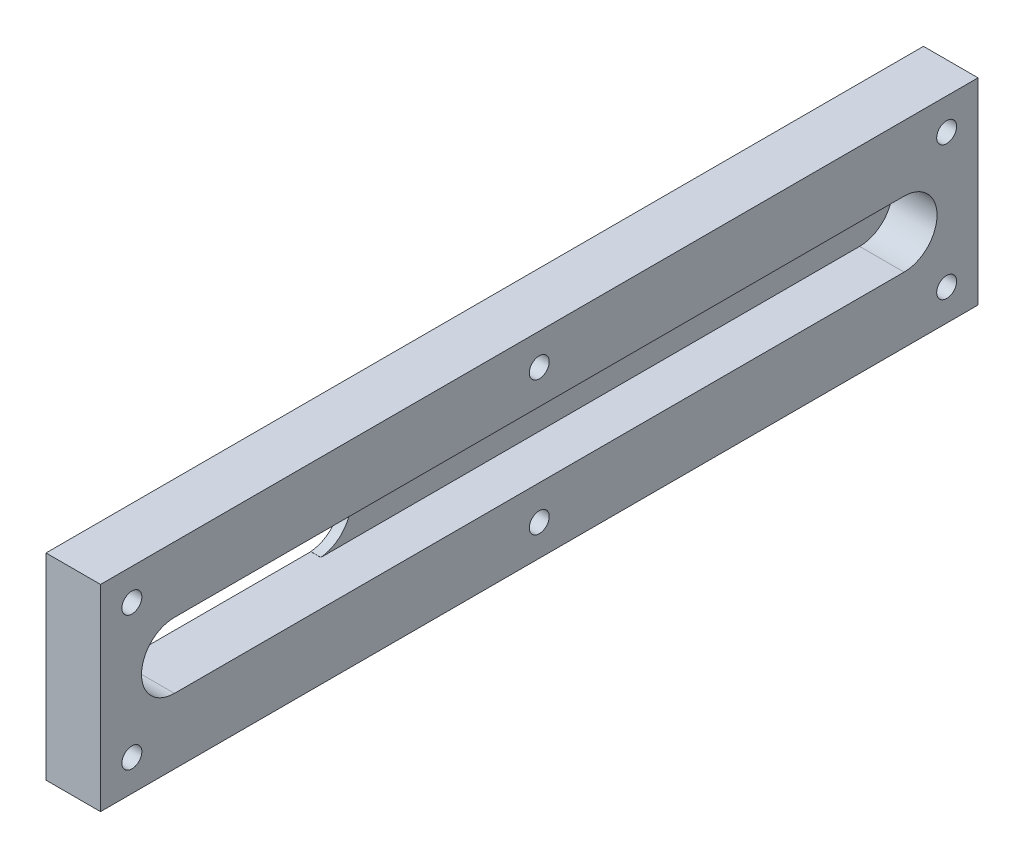
ISO-10303-21;
HEADER;
FILE_DESCRIPTION(('STEP AP214'),'2;1');
FILE_NAME('part.step','',(''),(''),'','','');
FILE_SCHEMA(('AUTOMOTIVE_DESIGN { 1 0 10303 214 1 1 1 1 }'));
ENDSEC;
DATA;
#1=APPLICATION_CONTEXT('core data for automotive mechanical design processes');
#2=APPLICATION_PROTOCOL_DEFINITION('international standard','automotive_design',2000,#1);
#3=PRODUCT_CONTEXT('',#1,'mechanical');
#4=PRODUCT('Part','Part','',(#3));
#5=PRODUCT_RELATED_PRODUCT_CATEGORY('part','',(#4));
#6=PRODUCT_DEFINITION_FORMATION('','',#4);
#7=PRODUCT_DEFINITION_CONTEXT('part definition',#1,'design');
#8=PRODUCT_DEFINITION('design','',#6,#7);
#9=PRODUCT_DEFINITION_SHAPE('','',#8);
#10=(LENGTH_UNIT() NAMED_UNIT(*) SI_UNIT(.MILLI.,.METRE.));
#11=(NAMED_UNIT(*) PLANE_ANGLE_UNIT() SI_UNIT($,.RADIAN.));
#12=(NAMED_UNIT(*) SI_UNIT($,.STERADIAN.) SOLID_ANGLE_UNIT());
#13=UNCERTAINTY_MEASURE_WITH_UNIT(LENGTH_MEASURE(1.E-05),#10,'distance_accuracy_value','');
#14=(GEOMETRIC_REPRESENTATION_CONTEXT(3) GLOBAL_UNCERTAINTY_ASSIGNED_CONTEXT((#13)) GLOBAL_UNIT_ASSIGNED_CONTEXT((#10,
#11,#12)) REPRESENTATION_CONTEXT('',''));
#15=CARTESIAN_POINT('',(0.,0.,0.));
#16=DIRECTION('',(0.,0.,1.));
#17=DIRECTION('',(1.,0.,0.));
#18=AXIS2_PLACEMENT_3D('',#15,#16,#17);
#19=CARTESIAN_POINT('',(11.049,0.,-73.9252522));
#20=DIRECTION('',(-1.,0.,0.));
#21=DIRECTION('',(0.,0.,1.));
#22=AXIS2_PLACEMENT_3D('',#19,#20,#21);
#23=CYLINDRICAL_SURFACE('',#22,6.66750000000003);
#24=DIRECTION('',(-1.,0.,0.));
#25=VECTOR('',#24,1.);
#26=CARTESIAN_POINT('',(11.049,6.66750000000005,-73.9252522));
#27=LINE('',#26,#25);
#28=CARTESIAN_POINT('',(11.049,6.66750000000005,-73.9252522));
#29=VERTEX_POINT('',#28);
#30=CARTESIAN_POINT('',(2.032,6.66750000000005,-73.9252522));
#31=VERTEX_POINT('',#30);
#32=EDGE_CURVE('E68',#29,#31,#27,.T.);
#33=ORIENTED_EDGE('',*,*,#32,.T.);
#34=CARTESIAN_POINT('',(2.032,0.,-73.9252522));
#35=DIRECTION('',(-1.,0.,0.));
#36=DIRECTION('',(0.,0.,1.));
#37=AXIS2_PLACEMENT_3D('',#34,#35,#36);
#38=CIRCLE('',#37,6.66750000000003);
#39=CARTESIAN_POINT('',(2.032,-6.6675,-73.9252522));
#40=VERTEX_POINT('',#39);
#41=EDGE_CURVE('E140',#31,#40,#38,.T.);
#42=ORIENTED_EDGE('',*,*,#41,.T.);
#43=DIRECTION('',(-1.,0.,0.));
#44=VECTOR('',#43,1.);
#45=CARTESIAN_POINT('',(11.049,-6.6675,-73.9252522));
#46=LINE('',#45,#44);
#47=CARTESIAN_POINT('',(11.049,-6.6675,-73.9252522));
#48=VERTEX_POINT('',#47);
#49=EDGE_CURVE('E150',#48,#40,#46,.T.);
#50=ORIENTED_EDGE('',*,*,#49,.F.);
#51=CARTESIAN_POINT('',(11.049,0.,-73.9252522));
#52=DIRECTION('',(1.,0.,0.));
#53=DIRECTION('',(0.,0.,-1.));
#54=AXIS2_PLACEMENT_3D('',#51,#52,#53);
#55=CIRCLE('',#54,6.66750000000003);
#56=EDGE_CURVE('E510',#48,#29,#55,.T.);
#57=ORIENTED_EDGE('',*,*,#56,.T.);
#58=EDGE_LOOP('',(#33,#42,#50,#57));
#59=FACE_BOUND('',#58,.T.);
#60=ADVANCED_FACE('F45',(#59),#23,.F.);
#61=CARTESIAN_POINT('',(11.049,0.,0.));
#62=DIRECTION('',(1.,0.,0.));
#63=DIRECTION('',(0.,0.,-1.));
#64=AXIS2_PLACEMENT_3D('',#61,#62,#63);
#65=PLANE('',#64);
#66=CARTESIAN_POINT('',(11.049,13.589,82.5499999999999));
#67=DIRECTION('',(1.,0.,0.));
#68=DIRECTION('',(0.,0.,-1.));
#69=AXIS2_PLACEMENT_3D('',#66,#67,#68);
#70=CIRCLE('',#69,2.0193);
#71=CARTESIAN_POINT('',(11.049,13.589,80.5306999999999));
#72=VERTEX_POINT('',#71);
#73=EDGE_CURVE('E548',#72,#72,#70,.T.);
#74=ORIENTED_EDGE('',*,*,#73,.F.);
#75=EDGE_LOOP('',(#74));
#76=FACE_BOUND('',#75,.T.);
#77=CARTESIAN_POINT('',(11.049,-13.589,82.5499999999999));
#78=DIRECTION('',(1.,0.,0.));
#79=DIRECTION('',(0.,0.,-1.));
#80=AXIS2_PLACEMENT_3D('',#77,#78,#79);
#81=CIRCLE('',#80,2.0193);
#82=CARTESIAN_POINT('',(11.049,-13.589,80.5306999999999));
#83=VERTEX_POINT('',#82);
#84=EDGE_CURVE('E542',#83,#83,#81,.T.);
#85=ORIENTED_EDGE('',*,*,#84,.F.);
#86=EDGE_LOOP('',(#85));
#87=FACE_BOUND('',#86,.T.);
#88=CARTESIAN_POINT('',(11.049,-13.589,0.));
#89=DIRECTION('',(1.,0.,0.));
#90=DIRECTION('',(0.,0.,-1.));
#91=AXIS2_PLACEMENT_3D('',#88,#89,#90);
#92=CIRCLE('',#91,2.0193);
#93=CARTESIAN_POINT('',(11.049,-13.589,-2.0193));
#94=VERTEX_POINT('',#93);
#95=EDGE_CURVE('E536',#94,#94,#92,.T.);
#96=ORIENTED_EDGE('',*,*,#95,.F.);
#97=EDGE_LOOP('',(#96));
#98=FACE_BOUND('',#97,.T.);
#99=CARTESIAN_POINT('',(11.049,-13.589,-82.5499999999999));
#100=DIRECTION('',(1.,0.,0.));
#101=DIRECTION('',(0.,0.,-1.));
#102=AXIS2_PLACEMENT_3D('',#99,#100,#101);
#103=CIRCLE('',#102,2.0193);
#104=CARTESIAN_POINT('',(11.049,-13.589,-84.5692999999999));
#105=VERTEX_POINT('',#104);
#106=EDGE_CURVE('E530',#105,#105,#103,.T.);
#107=ORIENTED_EDGE('',*,*,#106,.F.);
#108=EDGE_LOOP('',(#107));
#109=FACE_BOUND('',#108,.T.);
#110=CARTESIAN_POINT('',(11.049,13.589,-82.5499999999999));
#111=DIRECTION('',(1.,0.,0.));
#112=DIRECTION('',(0.,0.,-1.));
#113=AXIS2_PLACEMENT_3D('',#110,#111,#112);
#114=CIRCLE('',#113,2.0193);
#115=CARTESIAN_POINT('',(11.049,13.589,-84.5692999999999));
#116=VERTEX_POINT('',#115);
#117=EDGE_CURVE('E524',#116,#116,#114,.T.);
#118=ORIENTED_EDGE('',*,*,#117,.F.);
#119=EDGE_LOOP('',(#118));
#120=FACE_BOUND('',#119,.T.);
#121=CARTESIAN_POINT('',(11.049,13.589,0.));
#122=DIRECTION('',(1.,0.,0.));
#123=DIRECTION('',(0.,0.,-1.));
#124=AXIS2_PLACEMENT_3D('',#121,#122,#123);
#125=CIRCLE('',#124,2.0193);
#126=CARTESIAN_POINT('',(11.049,13.589,-2.0193));
#127=VERTEX_POINT('',#126);
#128=EDGE_CURVE('E518',#127,#127,#125,.T.);
#129=ORIENTED_EDGE('',*,*,#128,.F.);
#130=EDGE_LOOP('',(#129));
#131=FACE_BOUND('',#130,.T.);
#132=DIRECTION('',(0.,-1.,0.));
#133=VECTOR('',#132,1.);
#134=CARTESIAN_POINT('',(11.049,-19.939,88.8999999999999));
#135=LINE('',#134,#133);
#136=CARTESIAN_POINT('',(11.049,19.939,88.8999999999999));
#137=VERTEX_POINT('',#136);
#138=CARTESIAN_POINT('',(11.049,-19.939,88.8999999999999));
#139=VERTEX_POINT('',#138);
#140=EDGE_CURVE('E166',#137,#139,#135,.T.);
#141=ORIENTED_EDGE('',*,*,#140,.T.);
#142=DIRECTION('',(0.,0.,-1.));
#143=VECTOR('',#142,1.);
#144=CARTESIAN_POINT('',(11.049,-19.939,-88.9));
#145=LINE('',#144,#143);
#146=CARTESIAN_POINT('',(11.049,-19.939,-88.9));
#147=VERTEX_POINT('',#146);
#148=EDGE_CURVE('E169',#139,#147,#145,.T.);
#149=ORIENTED_EDGE('',*,*,#148,.T.);
#150=DIRECTION('',(0.,1.,0.));
#151=VECTOR('',#150,1.);
#152=CARTESIAN_POINT('',(11.049,-19.939,-88.9));
#153=LINE('',#152,#151);
#154=CARTESIAN_POINT('',(11.049,19.939,-88.9));
#155=VERTEX_POINT('',#154);
#156=EDGE_CURVE('E172',#147,#155,#153,.T.);
#157=ORIENTED_EDGE('',*,*,#156,.T.);
#158=DIRECTION('',(0.,0.,1.));
#159=VECTOR('',#158,1.);
#160=CARTESIAN_POINT('',(11.049,19.939,-88.9));
#161=LINE('',#160,#159);
#162=EDGE_CURVE('E174',#155,#137,#161,.T.);
#163=ORIENTED_EDGE('',*,*,#162,.T.);
#164=EDGE_LOOP('',(#141,#149,#157,#163));
#165=FACE_BOUND('',#164,.T.);
#166=DIRECTION('',(0.,0.,-1.));
#167=VECTOR('',#166,1.);
#168=CARTESIAN_POINT('',(11.049,-6.66750000000003,73.9252522));
#169=LINE('',#168,#167);
#170=CARTESIAN_POINT('',(11.049,-6.66750000000003,73.9252522));
#171=VERTEX_POINT('',#170);
#172=EDGE_CURVE('E156',#171,#48,#169,.T.);
#173=ORIENTED_EDGE('',*,*,#172,.F.);
#174=CARTESIAN_POINT('',(11.049,0.,73.9252522));
#175=DIRECTION('',(1.,0.,0.));
#176=DIRECTION('',(0.,0.,-1.));
#177=AXIS2_PLACEMENT_3D('',#174,#175,#176);
#178=CIRCLE('',#177,6.66750000000003);
#179=CARTESIAN_POINT('',(11.049,6.66750000000003,73.9252522));
#180=VERTEX_POINT('',#179);
#181=EDGE_CURVE('E500',#180,#171,#178,.T.);
#182=ORIENTED_EDGE('',*,*,#181,.F.);
#183=DIRECTION('',(0.,0.,1.));
#184=VECTOR('',#183,1.);
#185=CARTESIAN_POINT('',(11.049,6.66750000000003,73.9252522));
#186=LINE('',#185,#184);
#187=EDGE_CURVE('E506',#29,#180,#186,.T.);
#188=ORIENTED_EDGE('',*,*,#187,.F.);
#189=ORIENTED_EDGE('',*,*,#56,.F.);
#190=EDGE_LOOP('',(#173,#182,#188,#189));
#191=FACE_BOUND('',#190,.T.);
#192=ADVANCED_FACE('F208',(#76,#87,#98,#109,#120,#131,#165,#191),#65,.T.);
#193=CARTESIAN_POINT('',(0.,0.,0.));
#194=DIRECTION('',(1.,0.,0.));
#195=DIRECTION('',(0.,0.,-1.));
#196=AXIS2_PLACEMENT_3D('',#193,#194,#195);
#197=PLANE('',#196);
#198=DIRECTION('',(0.,0.,-1.));
#199=VECTOR('',#198,1.);
#200=CARTESIAN_POINT('',(0.,-6.66750000000003,73.9252522));
#201=LINE('',#200,#199);
#202=CARTESIAN_POINT('',(0.,-6.66750000000003,73.9252522));
#203=VERTEX_POINT('',#202);
#204=CARTESIAN_POINT('',(0.,-6.66750000000003,35.2438196243732));
#205=VERTEX_POINT('',#204);
#206=EDGE_CURVE('E490',#203,#205,#201,.T.);
#207=ORIENTED_EDGE('',*,*,#206,.T.);
#208=DIRECTION('',(0.,1.,0.));
#209=VECTOR('',#208,1.);
#210=CARTESIAN_POINT('',(0.,-6.64210000000003,35.2438196243732));
#211=LINE('',#210,#209);
#212=CARTESIAN_POINT('',(0.,-6.64210000000003,35.2438196243732));
#213=VERTEX_POINT('',#212);
#214=EDGE_CURVE('E483',#205,#213,#211,.T.);
#215=ORIENTED_EDGE('',*,*,#214,.T.);
#216=CARTESIAN_POINT('',(0.,0.,35.8252522));
#217=DIRECTION('',(1.,0.,0.));
#218=DIRECTION('',(0.,0.,1.));
#219=AXIS2_PLACEMENT_3D('',#216,#217,#218);
#220=CIRCLE('',#219,6.66750000000003);
#221=CARTESIAN_POINT('',(0.,6.64210000000003,35.2438196243732));
#222=VERTEX_POINT('',#221);
#223=EDGE_CURVE('E488',#213,#222,#220,.T.);
#224=ORIENTED_EDGE('',*,*,#223,.T.);
#225=DIRECTION('',(0.,1.,0.));
#226=VECTOR('',#225,1.);
#227=CARTESIAN_POINT('',(0.,6.66750000000002,35.2438196243732));
#228=LINE('',#227,#226);
#229=CARTESIAN_POINT('',(0.,6.66750000000003,35.2438196243732));
#230=VERTEX_POINT('',#229);
#231=EDGE_CURVE('E60',#222,#230,#228,.T.);
#232=ORIENTED_EDGE('',*,*,#231,.T.);
#233=DIRECTION('',(0.,0.,1.));
#234=VECTOR('',#233,1.);
#235=CARTESIAN_POINT('',(0.,6.66750000000003,73.9252522));
#236=LINE('',#235,#234);
#237=CARTESIAN_POINT('',(0.,6.66750000000003,73.9252522));
#238=VERTEX_POINT('',#237);
#239=EDGE_CURVE('E497',#230,#238,#236,.T.);
#240=ORIENTED_EDGE('',*,*,#239,.T.);
#241=CARTESIAN_POINT('',(0.,0.,73.9252522));
#242=DIRECTION('',(1.,0.,0.));
#243=DIRECTION('',(0.,0.,-1.));
#244=AXIS2_PLACEMENT_3D('',#241,#242,#243);
#245=CIRCLE('',#244,6.66750000000003);
#246=EDGE_CURVE('E496',#238,#203,#245,.T.);
#247=ORIENTED_EDGE('',*,*,#246,.T.);
#248=EDGE_LOOP('',(#207,#215,#224,#232,#240,#247));
#249=FACE_BOUND('',#248,.T.);
#250=CARTESIAN_POINT('',(0.,13.589,82.5499999999999));
#251=DIRECTION('',(1.,0.,0.));
#252=DIRECTION('',(0.,0.,-1.));
#253=AXIS2_PLACEMENT_3D('',#250,#251,#252);
#254=CIRCLE('',#253,2.0193);
#255=CARTESIAN_POINT('',(0.,13.589,80.5306999999999));
#256=VERTEX_POINT('',#255);
#257=EDGE_CURVE('E545',#256,#256,#254,.T.);
#258=ORIENTED_EDGE('',*,*,#257,.T.);
#259=EDGE_LOOP('',(#258));
#260=FACE_BOUND('',#259,.T.);
#261=CARTESIAN_POINT('',(0.,-13.589,82.5499999999999));
#262=DIRECTION('',(1.,0.,0.));
#263=DIRECTION('',(0.,0.,-1.));
#264=AXIS2_PLACEMENT_3D('',#261,#262,#263);
#265=CIRCLE('',#264,2.0193);
#266=CARTESIAN_POINT('',(0.,-13.589,80.5306999999999));
#267=VERTEX_POINT('',#266);
#268=EDGE_CURVE('E539',#267,#267,#265,.T.);
#269=ORIENTED_EDGE('',*,*,#268,.T.);
#270=EDGE_LOOP('',(#269));
#271=FACE_BOUND('',#270,.T.);
#272=CARTESIAN_POINT('',(0.,-13.589,0.));
#273=DIRECTION('',(1.,0.,0.));
#274=DIRECTION('',(0.,0.,-1.));
#275=AXIS2_PLACEMENT_3D('',#272,#273,#274);
#276=CIRCLE('',#275,2.0193);
#277=CARTESIAN_POINT('',(0.,-13.589,-2.0193));
#278=VERTEX_POINT('',#277);
#279=EDGE_CURVE('E533',#278,#278,#276,.T.);
#280=ORIENTED_EDGE('',*,*,#279,.T.);
#281=EDGE_LOOP('',(#280));
#282=FACE_BOUND('',#281,.T.);
#283=CARTESIAN_POINT('',(0.,-13.589,-82.5499999999999));
#284=DIRECTION('',(1.,0.,0.));
#285=DIRECTION('',(0.,0.,-1.));
#286=AXIS2_PLACEMENT_3D('',#283,#284,#285);
#287=CIRCLE('',#286,2.0193);
#288=CARTESIAN_POINT('',(0.,-13.589,-84.5692999999999));
#289=VERTEX_POINT('',#288);
#290=EDGE_CURVE('E527',#289,#289,#287,.T.);
#291=ORIENTED_EDGE('',*,*,#290,.T.);
#292=EDGE_LOOP('',(#291));
#293=FACE_BOUND('',#292,.T.);
#294=CARTESIAN_POINT('',(0.,13.589,-82.5499999999999));
#295=DIRECTION('',(1.,0.,0.));
#296=DIRECTION('',(0.,0.,-1.));
#297=AXIS2_PLACEMENT_3D('',#294,#295,#296);
#298=CIRCLE('',#297,2.0193);
#299=CARTESIAN_POINT('',(0.,13.589,-84.5692999999999));
#300=VERTEX_POINT('',#299);
#301=EDGE_CURVE('E521',#300,#300,#298,.T.);
#302=ORIENTED_EDGE('',*,*,#301,.T.);
#303=EDGE_LOOP('',(#302));
#304=FACE_BOUND('',#303,.T.);
#305=CARTESIAN_POINT('',(0.,13.589,0.));
#306=DIRECTION('',(1.,0.,0.));
#307=DIRECTION('',(0.,0.,-1.));
#308=AXIS2_PLACEMENT_3D('',#305,#306,#307);
#309=CIRCLE('',#308,2.0193);
#310=CARTESIAN_POINT('',(0.,13.589,-2.0193));
#311=VERTEX_POINT('',#310);
#312=EDGE_CURVE('E502',#311,#311,#309,.T.);
#313=ORIENTED_EDGE('',*,*,#312,.T.);
#314=EDGE_LOOP('',(#313));
#315=FACE_BOUND('',#314,.T.);
#316=DIRECTION('',(0.,-1.,0.));
#317=VECTOR('',#316,1.);
#318=CARTESIAN_POINT('',(0.,-19.939,88.8999999999999));
#319=LINE('',#318,#317);
#320=CARTESIAN_POINT('',(0.,19.939,88.8999999999999));
#321=VERTEX_POINT('',#320);
#322=CARTESIAN_POINT('',(0.,-19.939,88.8999999999999));
#323=VERTEX_POINT('',#322);
#324=EDGE_CURVE('E160',#321,#323,#319,.T.);
#325=ORIENTED_EDGE('',*,*,#324,.F.);
#326=DIRECTION('',(0.,0.,1.));
#327=VECTOR('',#326,1.);
#328=CARTESIAN_POINT('',(0.,19.939,-88.9));
#329=LINE('',#328,#327);
#330=CARTESIAN_POINT('',(0.,19.939,-88.9));
#331=VERTEX_POINT('',#330);
#332=EDGE_CURVE('E170',#331,#321,#329,.T.);
#333=ORIENTED_EDGE('',*,*,#332,.F.);
#334=DIRECTION('',(0.,1.,0.));
#335=VECTOR('',#334,1.);
#336=CARTESIAN_POINT('',(0.,-19.939,-88.9));
#337=LINE('',#336,#335);
#338=CARTESIAN_POINT('',(0.,-19.939,-88.9));
#339=VERTEX_POINT('',#338);
#340=EDGE_CURVE('E181',#339,#331,#337,.T.);
#341=ORIENTED_EDGE('',*,*,#340,.F.);
#342=DIRECTION('',(0.,0.,-1.));
#343=VECTOR('',#342,1.);
#344=CARTESIAN_POINT('',(0.,-19.939,-88.9));
#345=LINE('',#344,#343);
#346=EDGE_CURVE('E179',#323,#339,#345,.T.);
#347=ORIENTED_EDGE('',*,*,#346,.F.);
#348=EDGE_LOOP('',(#325,#333,#341,#347));
#349=FACE_BOUND('',#348,.T.);
#350=ADVANCED_FACE('F199',(#249,#260,#271,#282,#293,#304,#315,#349),#197,.F.);
#351=CARTESIAN_POINT('',(11.049,-19.939,88.8999999999999));
#352=DIRECTION('',(0.,0.,-1.));
#353=DIRECTION('',(-1.,0.,0.));
#354=AXIS2_PLACEMENT_3D('',#351,#352,#353);
#355=PLANE('',#354);
#356=ORIENTED_EDGE('',*,*,#324,.T.);
#357=DIRECTION('',(-1.,0.,0.));
#358=VECTOR('',#357,1.);
#359=CARTESIAN_POINT('',(11.049,-19.939,88.8999999999999));
#360=LINE('',#359,#358);
#361=EDGE_CURVE('E11',#139,#323,#360,.T.);
#362=ORIENTED_EDGE('',*,*,#361,.F.);
#363=ORIENTED_EDGE('',*,*,#140,.F.);
#364=DIRECTION('',(-1.,0.,0.));
#365=VECTOR('',#364,1.);
#366=CARTESIAN_POINT('',(11.049,19.939,88.8999999999999));
#367=LINE('',#366,#365);
#368=EDGE_CURVE('E176',#137,#321,#367,.T.);
#369=ORIENTED_EDGE('',*,*,#368,.T.);
#370=EDGE_LOOP('',(#356,#362,#363,#369));
#371=FACE_BOUND('',#370,.T.);
#372=ADVANCED_FACE('F47',(#371),#355,.F.);
#373=CARTESIAN_POINT('',(11.049,-19.939,-88.9));
#374=DIRECTION('',(0.,1.,0.));
#375=DIRECTION('',(0.,0.,1.));
#376=AXIS2_PLACEMENT_3D('',#373,#374,#375);
#377=PLANE('',#376);
#378=ORIENTED_EDGE('',*,*,#346,.T.);
#379=DIRECTION('',(-1.,0.,0.));
#380=VECTOR('',#379,1.);
#381=CARTESIAN_POINT('',(11.049,-19.939,-88.9));
#382=LINE('',#381,#380);
#383=EDGE_CURVE('E53',#147,#339,#382,.T.);
#384=ORIENTED_EDGE('',*,*,#383,.F.);
#385=ORIENTED_EDGE('',*,*,#148,.F.);
#386=ORIENTED_EDGE('',*,*,#361,.T.);
#387=EDGE_LOOP('',(#378,#384,#385,#386));
#388=FACE_BOUND('',#387,.T.);
#389=ADVANCED_FACE('F210',(#388),#377,.F.);
#390=CARTESIAN_POINT('',(11.049,-19.939,-88.9));
#391=DIRECTION('',(0.,0.,1.));
#392=DIRECTION('',(1.,0.,0.));
#393=AXIS2_PLACEMENT_3D('',#390,#391,#392);
#394=PLANE('',#393);
#395=ORIENTED_EDGE('',*,*,#340,.T.);
#396=DIRECTION('',(-1.,0.,0.));
#397=VECTOR('',#396,1.);
#398=CARTESIAN_POINT('',(11.049,19.939,-88.9));
#399=LINE('',#398,#397);
#400=EDGE_CURVE('E186',#155,#331,#399,.T.);
#401=ORIENTED_EDGE('',*,*,#400,.F.);
#402=ORIENTED_EDGE('',*,*,#156,.F.);
#403=ORIENTED_EDGE('',*,*,#383,.T.);
#404=EDGE_LOOP('',(#395,#401,#402,#403));
#405=FACE_BOUND('',#404,.T.);
#406=ADVANCED_FACE('F193',(#405),#394,.F.);
#407=CARTESIAN_POINT('',(11.049,19.939,-88.9));
#408=DIRECTION('',(0.,-1.,0.));
#409=DIRECTION('',(0.,0.,-1.));
#410=AXIS2_PLACEMENT_3D('',#407,#408,#409);
#411=PLANE('',#410);
#412=ORIENTED_EDGE('',*,*,#332,.T.);
#413=ORIENTED_EDGE('',*,*,#368,.F.);
#414=ORIENTED_EDGE('',*,*,#162,.F.);
#415=ORIENTED_EDGE('',*,*,#400,.T.);
#416=EDGE_LOOP('',(#412,#413,#414,#415));
#417=FACE_BOUND('',#416,.T.);
#418=ADVANCED_FACE('F202',(#417),#411,.F.);
#419=CARTESIAN_POINT('',(11.049,0.,73.9252522));
#420=DIRECTION('',(-1.,0.,0.));
#421=DIRECTION('',(0.,0.,1.));
#422=AXIS2_PLACEMENT_3D('',#419,#420,#421);
#423=CYLINDRICAL_SURFACE('',#422,6.66750000000003);
#424=ORIENTED_EDGE('',*,*,#246,.F.);
#425=DIRECTION('',(-1.,0.,0.));
#426=VECTOR('',#425,1.);
#427=CARTESIAN_POINT('',(11.049,6.66750000000003,73.9252522));
#428=LINE('',#427,#426);
#429=EDGE_CURVE('E162',#180,#238,#428,.T.);
#430=ORIENTED_EDGE('',*,*,#429,.F.);
#431=ORIENTED_EDGE('',*,*,#181,.T.);
#432=DIRECTION('',(-1.,0.,0.));
#433=VECTOR('',#432,1.);
#434=CARTESIAN_POINT('',(11.049,-6.66750000000003,73.9252522));
#435=LINE('',#434,#433);
#436=EDGE_CURVE('E157',#171,#203,#435,.T.);
#437=ORIENTED_EDGE('',*,*,#436,.T.);
#438=EDGE_LOOP('',(#424,#430,#431,#437));
#439=FACE_BOUND('',#438,.T.);
#440=ADVANCED_FACE('F230',(#439),#423,.F.);
#441=CARTESIAN_POINT('',(11.049,-6.66750000000003,73.9252522));
#442=DIRECTION('',(0.,1.,0.));
#443=DIRECTION('',(0.,0.,1.));
#444=AXIS2_PLACEMENT_3D('',#441,#442,#443);
#445=PLANE('',#444);
#446=DIRECTION('',(-1.,0.,0.));
#447=VECTOR('',#446,1.);
#448=CARTESIAN_POINT('',(2.032,-6.66750000000003,35.2438196243732));
#449=LINE('',#448,#447);
#450=CARTESIAN_POINT('',(2.032,-6.66750000000003,35.2438196243732));
#451=VERTEX_POINT('',#450);
#452=EDGE_CURVE('E484',#451,#205,#449,.T.);
#453=ORIENTED_EDGE('',*,*,#452,.T.);
#454=ORIENTED_EDGE('',*,*,#206,.F.);
#455=ORIENTED_EDGE('',*,*,#436,.F.);
#456=ORIENTED_EDGE('',*,*,#172,.T.);
#457=ORIENTED_EDGE('',*,*,#49,.T.);
#458=DIRECTION('',(0.,0.,1.));
#459=VECTOR('',#458,1.);
#460=CARTESIAN_POINT('',(2.032,-6.6675,-73.9252522));
#461=LINE('',#460,#459);
#462=EDGE_CURVE('E136',#40,#451,#461,.T.);
#463=ORIENTED_EDGE('',*,*,#462,.T.);
#464=EDGE_LOOP('',(#453,#454,#455,#456,#457,#463));
#465=FACE_BOUND('',#464,.T.);
#466=ADVANCED_FACE('F153',(#465),#445,.T.);
#467=CARTESIAN_POINT('',(11.049,6.66750000000003,73.9252522));
#468=DIRECTION('',(0.,-1.,0.));
#469=DIRECTION('',(0.,0.,-1.));
#470=AXIS2_PLACEMENT_3D('',#467,#468,#469);
#471=PLANE('',#470);
#472=DIRECTION('',(-1.,0.,0.));
#473=VECTOR('',#472,1.);
#474=CARTESIAN_POINT('',(2.032,6.66750000000002,35.2438196243732));
#475=LINE('',#474,#473);
#476=CARTESIAN_POINT('',(2.032,6.66750000000002,35.2438196243732));
#477=VERTEX_POINT('',#476);
#478=EDGE_CURVE('E550',#477,#230,#475,.T.);
#479=ORIENTED_EDGE('',*,*,#478,.F.);
#480=DIRECTION('',(0.,0.,-1.));
#481=VECTOR('',#480,1.);
#482=CARTESIAN_POINT('',(2.032,6.66750000000002,35.2438196243732));
#483=LINE('',#482,#481);
#484=EDGE_CURVE('E491',#477,#31,#483,.T.);
#485=ORIENTED_EDGE('',*,*,#484,.T.);
#486=ORIENTED_EDGE('',*,*,#32,.F.);
#487=ORIENTED_EDGE('',*,*,#187,.T.);
#488=ORIENTED_EDGE('',*,*,#429,.T.);
#489=ORIENTED_EDGE('',*,*,#239,.F.);
#490=EDGE_LOOP('',(#479,#485,#486,#487,#488,#489));
#491=FACE_BOUND('',#490,.T.);
#492=ADVANCED_FACE('F226',(#491),#471,.T.);
#493=CARTESIAN_POINT('',(11.049,13.589,0.));
#494=DIRECTION('',(1.,0.,0.));
#495=DIRECTION('',(0.,0.,-1.));
#496=AXIS2_PLACEMENT_3D('',#493,#494,#495);
#497=CYLINDRICAL_SURFACE('',#496,2.0193);
#498=ORIENTED_EDGE('',*,*,#312,.F.);
#499=EDGE_LOOP('',(#498));
#500=FACE_BOUND('',#499,.T.);
#501=ORIENTED_EDGE('',*,*,#128,.T.);
#502=EDGE_LOOP('',(#501));
#503=FACE_BOUND('',#502,.T.);
#504=ADVANCED_FACE('F257',(#500,#503),#497,.F.);
#505=CARTESIAN_POINT('',(11.049,13.589,-82.5499999999999));
#506=DIRECTION('',(1.,0.,0.));
#507=DIRECTION('',(0.,0.,-1.));
#508=AXIS2_PLACEMENT_3D('',#505,#506,#507);
#509=CYLINDRICAL_SURFACE('',#508,2.0193);
#510=ORIENTED_EDGE('',*,*,#301,.F.);
#511=EDGE_LOOP('',(#510));
#512=FACE_BOUND('',#511,.T.);
#513=ORIENTED_EDGE('',*,*,#117,.T.);
#514=EDGE_LOOP('',(#513));
#515=FACE_BOUND('',#514,.T.);
#516=ADVANCED_FACE('F264',(#512,#515),#509,.F.);
#517=CARTESIAN_POINT('',(11.049,-13.589,-82.5499999999999));
#518=DIRECTION('',(1.,0.,0.));
#519=DIRECTION('',(0.,0.,-1.));
#520=AXIS2_PLACEMENT_3D('',#517,#518,#519);
#521=CYLINDRICAL_SURFACE('',#520,2.0193);
#522=ORIENTED_EDGE('',*,*,#290,.F.);
#523=EDGE_LOOP('',(#522));
#524=FACE_BOUND('',#523,.T.);
#525=ORIENTED_EDGE('',*,*,#106,.T.);
#526=EDGE_LOOP('',(#525));
#527=FACE_BOUND('',#526,.T.);
#528=ADVANCED_FACE('F272',(#524,#527),#521,.F.);
#529=CARTESIAN_POINT('',(11.049,-13.589,0.));
#530=DIRECTION('',(1.,0.,0.));
#531=DIRECTION('',(0.,0.,-1.));
#532=AXIS2_PLACEMENT_3D('',#529,#530,#531);
#533=CYLINDRICAL_SURFACE('',#532,2.0193);
#534=ORIENTED_EDGE('',*,*,#279,.F.);
#535=EDGE_LOOP('',(#534));
#536=FACE_BOUND('',#535,.T.);
#537=ORIENTED_EDGE('',*,*,#95,.T.);
#538=EDGE_LOOP('',(#537));
#539=FACE_BOUND('',#538,.T.);
#540=ADVANCED_FACE('F280',(#536,#539),#533,.F.);
#541=CARTESIAN_POINT('',(11.049,-13.589,82.5499999999999));
#542=DIRECTION('',(1.,0.,0.));
#543=DIRECTION('',(0.,0.,-1.));
#544=AXIS2_PLACEMENT_3D('',#541,#542,#543);
#545=CYLINDRICAL_SURFACE('',#544,2.0193);
#546=ORIENTED_EDGE('',*,*,#268,.F.);
#547=EDGE_LOOP('',(#546));
#548=FACE_BOUND('',#547,.T.);
#549=ORIENTED_EDGE('',*,*,#84,.T.);
#550=EDGE_LOOP('',(#549));
#551=FACE_BOUND('',#550,.T.);
#552=ADVANCED_FACE('F288',(#548,#551),#545,.F.);
#553=CARTESIAN_POINT('',(11.049,13.589,82.5499999999999));
#554=DIRECTION('',(1.,0.,0.));
#555=DIRECTION('',(0.,0.,-1.));
#556=AXIS2_PLACEMENT_3D('',#553,#554,#555);
#557=CYLINDRICAL_SURFACE('',#556,2.0193);
#558=ORIENTED_EDGE('',*,*,#257,.F.);
#559=EDGE_LOOP('',(#558));
#560=FACE_BOUND('',#559,.T.);
#561=ORIENTED_EDGE('',*,*,#73,.T.);
#562=EDGE_LOOP('',(#561));
#563=FACE_BOUND('',#562,.T.);
#564=ADVANCED_FACE('F296',(#560,#563),#557,.F.);
#565=CARTESIAN_POINT('',(2.032,6.66750000000002,35.2438196243732));
#566=DIRECTION('',(0.,0.,1.));
#567=DIRECTION('',(1.,0.,0.));
#568=AXIS2_PLACEMENT_3D('',#565,#566,#567);
#569=PLANE('',#568);
#570=ORIENTED_EDGE('',*,*,#231,.F.);
#571=DIRECTION('',(-1.,0.,0.));
#572=VECTOR('',#571,1.);
#573=CARTESIAN_POINT('',(2.032,6.64210000000003,35.2438196243732));
#574=LINE('',#573,#572);
#575=CARTESIAN_POINT('',(2.032,6.64210000000003,35.2438196243732));
#576=VERTEX_POINT('',#575);
#577=EDGE_CURVE('E553',#576,#222,#574,.T.);
#578=ORIENTED_EDGE('',*,*,#577,.F.);
#579=DIRECTION('',(0.,1.,0.));
#580=VECTOR('',#579,1.);
#581=CARTESIAN_POINT('',(2.032,6.66750000000002,35.2438196243732));
#582=LINE('',#581,#580);
#583=EDGE_CURVE('E559',#576,#477,#582,.T.);
#584=ORIENTED_EDGE('',*,*,#583,.T.);
#585=ORIENTED_EDGE('',*,*,#478,.T.);
#586=EDGE_LOOP('',(#570,#578,#584,#585));
#587=FACE_BOUND('',#586,.T.);
#588=ADVANCED_FACE('F304',(#587),#569,.T.);
#589=CARTESIAN_POINT('',(2.032,0.,35.8252522));
#590=DIRECTION('',(-1.,0.,0.));
#591=DIRECTION('',(0.,0.,1.));
#592=AXIS2_PLACEMENT_3D('',#589,#590,#591);
#593=CYLINDRICAL_SURFACE('',#592,6.66750000000003);
#594=ORIENTED_EDGE('',*,*,#223,.F.);
#595=DIRECTION('',(-1.,0.,0.));
#596=VECTOR('',#595,1.);
#597=CARTESIAN_POINT('',(2.032,-6.64210000000003,35.2438196243732));
#598=LINE('',#597,#596);
#599=CARTESIAN_POINT('',(2.032,-6.64210000000003,35.2438196243732));
#600=VERTEX_POINT('',#599);
#601=EDGE_CURVE('E485',#600,#213,#598,.T.);
#602=ORIENTED_EDGE('',*,*,#601,.F.);
#603=CARTESIAN_POINT('',(2.032,0.,35.8252522));
#604=DIRECTION('',(1.,0.,0.));
#605=DIRECTION('',(0.,0.,1.));
#606=AXIS2_PLACEMENT_3D('',#603,#604,#605);
#607=CIRCLE('',#606,6.66750000000003);
#608=EDGE_CURVE('E561',#600,#576,#607,.T.);
#609=ORIENTED_EDGE('',*,*,#608,.T.);
#610=ORIENTED_EDGE('',*,*,#577,.T.);
#611=EDGE_LOOP('',(#594,#602,#609,#610));
#612=FACE_BOUND('',#611,.T.);
#613=ADVANCED_FACE('F311',(#612),#593,.F.);
#614=CARTESIAN_POINT('',(2.032,-6.64210000000003,35.2438196243732));
#615=DIRECTION('',(0.,0.,1.));
#616=DIRECTION('',(1.,0.,0.));
#617=AXIS2_PLACEMENT_3D('',#614,#615,#616);
#618=PLANE('',#617);
#619=ORIENTED_EDGE('',*,*,#214,.F.);
#620=ORIENTED_EDGE('',*,*,#452,.F.);
#621=DIRECTION('',(0.,1.,0.));
#622=VECTOR('',#621,1.);
#623=CARTESIAN_POINT('',(2.032,-6.64210000000003,35.2438196243732));
#624=LINE('',#623,#622);
#625=EDGE_CURVE('E143',#451,#600,#624,.T.);
#626=ORIENTED_EDGE('',*,*,#625,.T.);
#627=ORIENTED_EDGE('',*,*,#601,.T.);
#628=EDGE_LOOP('',(#619,#620,#626,#627));
#629=FACE_BOUND('',#628,.T.);
#630=ADVANCED_FACE('F319',(#629),#618,.T.);
#631=CARTESIAN_POINT('',(2.032,0.,-73.9252522));
#632=DIRECTION('',(-1.,0.,0.));
#633=DIRECTION('',(0.,0.,1.));
#634=AXIS2_PLACEMENT_3D('',#631,#632,#633);
#635=PLANE('',#634);
#636=ORIENTED_EDGE('',*,*,#41,.F.);
#637=ORIENTED_EDGE('',*,*,#484,.F.);
#638=ORIENTED_EDGE('',*,*,#583,.F.);
#639=ORIENTED_EDGE('',*,*,#608,.F.);
#640=ORIENTED_EDGE('',*,*,#625,.F.);
#641=ORIENTED_EDGE('',*,*,#462,.F.);
#642=EDGE_LOOP('',(#636,#637,#638,#639,#640,#641));
#643=FACE_BOUND('',#642,.T.);
#644=ADVANCED_FACE('F138',(#643),#635,.F.);
#645=CLOSED_SHELL('',(#60,#192,#350,#372,#389,#406,#418,#440,#466,#492,#504,#516,#528,#540,#552,
#564,#588,#613,#630,#644));
#646=MANIFOLD_SOLID_BREP('B2',#645);
#647=ADVANCED_BREP_SHAPE_REPRESENTATION('',(#18,#646),#14);
#648=SHAPE_DEFINITION_REPRESENTATION(#9,#647);
ENDSEC;
END-ISO-10303-21;
